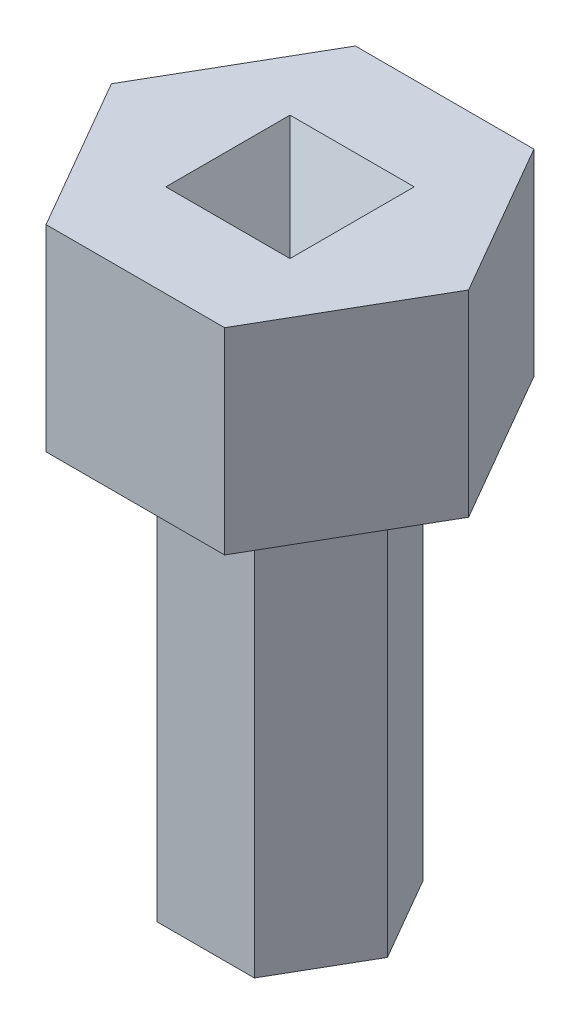
ISO-10303-21;
HEADER;
FILE_DESCRIPTION(('STEP AP214'),'2;1');
FILE_NAME('part.step','',(''),(''),'','','');
FILE_SCHEMA(('AUTOMOTIVE_DESIGN { 1 0 10303 214 1 1 1 1 }'));
ENDSEC;
DATA;
#1=APPLICATION_CONTEXT('core data for automotive mechanical design processes');
#2=APPLICATION_PROTOCOL_DEFINITION('international standard','automotive_design',2000,#1);
#3=PRODUCT_CONTEXT('',#1,'mechanical');
#4=PRODUCT('Part','Part','',(#3));
#5=PRODUCT_RELATED_PRODUCT_CATEGORY('part','',(#4));
#6=PRODUCT_DEFINITION_FORMATION('','',#4);
#7=PRODUCT_DEFINITION_CONTEXT('part definition',#1,'design');
#8=PRODUCT_DEFINITION('design','',#6,#7);
#9=PRODUCT_DEFINITION_SHAPE('','',#8);
#10=(LENGTH_UNIT() NAMED_UNIT(*) SI_UNIT(.MILLI.,.METRE.));
#11=(NAMED_UNIT(*) PLANE_ANGLE_UNIT() SI_UNIT($,.RADIAN.));
#12=(NAMED_UNIT(*) SI_UNIT($,.STERADIAN.) SOLID_ANGLE_UNIT());
#13=UNCERTAINTY_MEASURE_WITH_UNIT(LENGTH_MEASURE(1.E-05),#10,'distance_accuracy_value','');
#14=(GEOMETRIC_REPRESENTATION_CONTEXT(3) GLOBAL_UNCERTAINTY_ASSIGNED_CONTEXT((#13)) GLOBAL_UNIT_ASSIGNED_CONTEXT((#10,
#11,#12)) REPRESENTATION_CONTEXT('',''));
#15=CARTESIAN_POINT('',(0.,0.,0.));
#16=DIRECTION('',(0.,0.,1.));
#17=DIRECTION('',(1.,0.,0.));
#18=AXIS2_PLACEMENT_3D('',#15,#16,#17);
#19=CARTESIAN_POINT('',(-3.46410161513776,30.,6.));
#20=DIRECTION('',(0.,0.,-1.));
#21=DIRECTION('',(-1.,0.,0.));
#22=AXIS2_PLACEMENT_3D('',#19,#20,#21);
#23=PLANE('',#22);
#24=DIRECTION('',(1.,0.,0.));
#25=VECTOR('',#24,1.);
#26=CARTESIAN_POINT('',(-3.46410161513776,0.,6.));
#27=LINE('',#26,#25);
#28=CARTESIAN_POINT('',(-3.46410161513776,0.,6.));
#29=VERTEX_POINT('',#28);
#30=CARTESIAN_POINT('',(3.46410161513776,0.,6.));
#31=VERTEX_POINT('',#30);
#32=EDGE_CURVE('E212',#29,#31,#27,.T.);
#33=ORIENTED_EDGE('',*,*,#32,.T.);
#34=DIRECTION('',(0.,-1.,0.));
#35=VECTOR('',#34,1.);
#36=CARTESIAN_POINT('',(3.46410161513776,30.,6.));
#37=LINE('',#36,#35);
#38=CARTESIAN_POINT('',(3.46410161513776,30.,6.));
#39=VERTEX_POINT('',#38);
#40=EDGE_CURVE('E258',#39,#31,#37,.T.);
#41=ORIENTED_EDGE('',*,*,#40,.F.);
#42=DIRECTION('',(1.,0.,0.));
#43=VECTOR('',#42,1.);
#44=CARTESIAN_POINT('',(-3.46410161513776,30.,6.));
#45=LINE('',#44,#43);
#46=CARTESIAN_POINT('',(-3.46410161513776,30.,6.));
#47=VERTEX_POINT('',#46);
#48=EDGE_CURVE('E213',#47,#39,#45,.T.);
#49=ORIENTED_EDGE('',*,*,#48,.F.);
#50=DIRECTION('',(0.,-1.,0.));
#51=VECTOR('',#50,1.);
#52=CARTESIAN_POINT('',(-3.46410161513776,30.,6.));
#53=LINE('',#52,#51);
#54=EDGE_CURVE('E232',#47,#29,#53,.T.);
#55=ORIENTED_EDGE('',*,*,#54,.T.);
#56=EDGE_LOOP('',(#33,#41,#49,#55));
#57=FACE_BOUND('',#56,.T.);
#58=ADVANCED_FACE('F32',(#57),#23,.F.);
#59=CARTESIAN_POINT('',(3.46410161513776,30.,6.));
#60=DIRECTION('',(-0.866025403784439,0.,-0.5));
#61=DIRECTION('',(-0.5,0.,0.866025403784439));
#62=AXIS2_PLACEMENT_3D('',#59,#60,#61);
#63=PLANE('',#62);
#64=DIRECTION('',(0.5,0.,-0.866025403784438));
#65=VECTOR('',#64,1.);
#66=CARTESIAN_POINT('',(3.46410161513776,0.,6.));
#67=LINE('',#66,#65);
#68=CARTESIAN_POINT('',(6.92820323027551,0.,0.));
#69=VERTEX_POINT('',#68);
#70=EDGE_CURVE('E235',#31,#69,#67,.T.);
#71=ORIENTED_EDGE('',*,*,#70,.T.);
#72=DIRECTION('',(0.,-1.,0.));
#73=VECTOR('',#72,1.);
#74=CARTESIAN_POINT('',(6.92820323027551,30.,0.));
#75=LINE('',#74,#73);
#76=CARTESIAN_POINT('',(6.92820323027551,30.,0.));
#77=VERTEX_POINT('',#76);
#78=EDGE_CURVE('E255',#77,#69,#75,.T.);
#79=ORIENTED_EDGE('',*,*,#78,.F.);
#80=DIRECTION('',(0.5,0.,-0.866025403784438));
#81=VECTOR('',#80,1.);
#82=CARTESIAN_POINT('',(3.46410161513776,30.,6.));
#83=LINE('',#82,#81);
#84=EDGE_CURVE('E216',#39,#77,#83,.T.);
#85=ORIENTED_EDGE('',*,*,#84,.F.);
#86=ORIENTED_EDGE('',*,*,#40,.T.);
#87=EDGE_LOOP('',(#71,#79,#85,#86));
#88=FACE_BOUND('',#87,.T.);
#89=ADVANCED_FACE('F282',(#88),#63,.F.);
#90=CARTESIAN_POINT('',(6.92820323027551,30.,0.));
#91=DIRECTION('',(-0.866025403784439,0.,0.5));
#92=DIRECTION('',(0.5,0.,0.866025403784439));
#93=AXIS2_PLACEMENT_3D('',#90,#91,#92);
#94=PLANE('',#93);
#95=DIRECTION('',(-0.5,0.,-0.866025403784439));
#96=VECTOR('',#95,1.);
#97=CARTESIAN_POINT('',(6.92820323027551,0.,0.));
#98=LINE('',#97,#96);
#99=CARTESIAN_POINT('',(3.46410161513776,0.,-6.));
#100=VERTEX_POINT('',#99);
#101=EDGE_CURVE('E237',#69,#100,#98,.T.);
#102=ORIENTED_EDGE('',*,*,#101,.T.);
#103=DIRECTION('',(0.,-1.,0.));
#104=VECTOR('',#103,1.);
#105=CARTESIAN_POINT('',(3.46410161513776,30.,-6.));
#106=LINE('',#105,#104);
#107=CARTESIAN_POINT('',(3.46410161513776,30.,-6.));
#108=VERTEX_POINT('',#107);
#109=EDGE_CURVE('E252',#108,#100,#106,.T.);
#110=ORIENTED_EDGE('',*,*,#109,.F.);
#111=DIRECTION('',(-0.5,0.,-0.866025403784439));
#112=VECTOR('',#111,1.);
#113=CARTESIAN_POINT('',(6.92820323027551,30.,0.));
#114=LINE('',#113,#112);
#115=EDGE_CURVE('E220',#77,#108,#114,.T.);
#116=ORIENTED_EDGE('',*,*,#115,.F.);
#117=ORIENTED_EDGE('',*,*,#78,.T.);
#118=EDGE_LOOP('',(#102,#110,#116,#117));
#119=FACE_BOUND('',#118,.T.);
#120=ADVANCED_FACE('F288',(#119),#94,.F.);
#121=CARTESIAN_POINT('',(3.46410161513776,30.,-6.));
#122=DIRECTION('',(0.,0.,1.));
#123=DIRECTION('',(1.,0.,0.));
#124=AXIS2_PLACEMENT_3D('',#121,#122,#123);
#125=PLANE('',#124);
#126=DIRECTION('',(-1.,0.,0.));
#127=VECTOR('',#126,1.);
#128=CARTESIAN_POINT('',(3.46410161513776,0.,-6.));
#129=LINE('',#128,#127);
#130=CARTESIAN_POINT('',(-3.46410161513776,0.,-6.));
#131=VERTEX_POINT('',#130);
#132=EDGE_CURVE('E239',#100,#131,#129,.T.);
#133=ORIENTED_EDGE('',*,*,#132,.T.);
#134=DIRECTION('',(0.,-1.,0.));
#135=VECTOR('',#134,1.);
#136=CARTESIAN_POINT('',(-3.46410161513776,30.,-6.));
#137=LINE('',#136,#135);
#138=CARTESIAN_POINT('',(-3.46410161513776,30.,-6.));
#139=VERTEX_POINT('',#138);
#140=EDGE_CURVE('E249',#139,#131,#137,.T.);
#141=ORIENTED_EDGE('',*,*,#140,.F.);
#142=DIRECTION('',(-1.,0.,0.));
#143=VECTOR('',#142,1.);
#144=CARTESIAN_POINT('',(3.46410161513776,30.,-6.));
#145=LINE('',#144,#143);
#146=EDGE_CURVE('E223',#108,#139,#145,.T.);
#147=ORIENTED_EDGE('',*,*,#146,.F.);
#148=ORIENTED_EDGE('',*,*,#109,.T.);
#149=EDGE_LOOP('',(#133,#141,#147,#148));
#150=FACE_BOUND('',#149,.T.);
#151=ADVANCED_FACE('F294',(#150),#125,.F.);
#152=CARTESIAN_POINT('',(-3.46410161513776,30.,-6.));
#153=DIRECTION('',(0.866025403784439,0.,0.5));
#154=DIRECTION('',(0.5,0.,-0.866025403784439));
#155=AXIS2_PLACEMENT_3D('',#152,#153,#154);
#156=PLANE('',#155);
#157=DIRECTION('',(-0.5,0.,0.866025403784439));
#158=VECTOR('',#157,1.);
#159=CARTESIAN_POINT('',(-3.46410161513776,0.,-6.));
#160=LINE('',#159,#158);
#161=CARTESIAN_POINT('',(-6.92820323027551,0.,0.));
#162=VERTEX_POINT('',#161);
#163=EDGE_CURVE('E241',#131,#162,#160,.T.);
#164=ORIENTED_EDGE('',*,*,#163,.T.);
#165=DIRECTION('',(0.,-1.,0.));
#166=VECTOR('',#165,1.);
#167=CARTESIAN_POINT('',(-6.92820323027551,30.,0.));
#168=LINE('',#167,#166);
#169=CARTESIAN_POINT('',(-6.92820323027551,30.,0.));
#170=VERTEX_POINT('',#169);
#171=EDGE_CURVE('E246',#170,#162,#168,.T.);
#172=ORIENTED_EDGE('',*,*,#171,.F.);
#173=DIRECTION('',(-0.5,0.,0.866025403784439));
#174=VECTOR('',#173,1.);
#175=CARTESIAN_POINT('',(-3.46410161513776,30.,-6.));
#176=LINE('',#175,#174);
#177=EDGE_CURVE('E226',#139,#170,#176,.T.);
#178=ORIENTED_EDGE('',*,*,#177,.F.);
#179=ORIENTED_EDGE('',*,*,#140,.T.);
#180=EDGE_LOOP('',(#164,#172,#178,#179));
#181=FACE_BOUND('',#180,.T.);
#182=ADVANCED_FACE('F298',(#181),#156,.F.);
#183=CARTESIAN_POINT('',(-6.92820323027551,30.,0.));
#184=DIRECTION('',(0.866025403784439,0.,-0.5));
#185=DIRECTION('',(-0.5,0.,-0.866025403784439));
#186=AXIS2_PLACEMENT_3D('',#183,#184,#185);
#187=PLANE('',#186);
#188=DIRECTION('',(0.5,0.,0.866025403784439));
#189=VECTOR('',#188,1.);
#190=CARTESIAN_POINT('',(-6.92820323027551,0.,0.));
#191=LINE('',#190,#189);
#192=EDGE_CURVE('E217',#162,#29,#191,.T.);
#193=ORIENTED_EDGE('',*,*,#192,.T.);
#194=ORIENTED_EDGE('',*,*,#54,.F.);
#195=DIRECTION('',(0.5,0.,0.866025403784439));
#196=VECTOR('',#195,1.);
#197=CARTESIAN_POINT('',(-6.92820323027551,30.,0.));
#198=LINE('',#197,#196);
#199=EDGE_CURVE('E229',#170,#47,#198,.T.);
#200=ORIENTED_EDGE('',*,*,#199,.F.);
#201=ORIENTED_EDGE('',*,*,#171,.T.);
#202=EDGE_LOOP('',(#193,#194,#200,#201));
#203=FACE_BOUND('',#202,.T.);
#204=ADVANCED_FACE('F302',(#203),#187,.F.);
#205=CARTESIAN_POINT('',(0.,0.,0.));
#206=DIRECTION('',(0.,1.,0.));
#207=DIRECTION('',(0.,0.,1.));
#208=AXIS2_PLACEMENT_3D('',#205,#206,#207);
#209=PLANE('',#208);
#210=ORIENTED_EDGE('',*,*,#32,.F.);
#211=ORIENTED_EDGE('',*,*,#192,.F.);
#212=ORIENTED_EDGE('',*,*,#163,.F.);
#213=ORIENTED_EDGE('',*,*,#132,.F.);
#214=ORIENTED_EDGE('',*,*,#101,.F.);
#215=ORIENTED_EDGE('',*,*,#70,.F.);
#216=EDGE_LOOP('',(#210,#211,#212,#213,#214,#215));
#217=FACE_BOUND('',#216,.T.);
#218=ADVANCED_FACE('F306',(#217),#209,.F.);
#219=CARTESIAN_POINT('',(0.,30.,0.));
#220=DIRECTION('',(0.,1.,0.));
#221=DIRECTION('',(0.,0.,1.));
#222=AXIS2_PLACEMENT_3D('',#219,#220,#221);
#223=PLANE('',#222);
#224=DIRECTION('',(1.,0.,0.));
#225=VECTOR('',#224,1.);
#226=CARTESIAN_POINT('',(-6.35085296108588,30.,11.));
#227=LINE('',#226,#225);
#228=CARTESIAN_POINT('',(-6.35085296108588,30.,11.));
#229=VERTEX_POINT('',#228);
#230=CARTESIAN_POINT('',(6.35085296108588,30.,11.));
#231=VERTEX_POINT('',#230);
#232=EDGE_CURVE('E168',#229,#231,#227,.T.);
#233=ORIENTED_EDGE('',*,*,#232,.F.);
#234=DIRECTION('',(0.5,0.,0.866025403784438));
#235=VECTOR('',#234,1.);
#236=CARTESIAN_POINT('',(-12.7017059221718,30.,0.));
#237=LINE('',#236,#235);
#238=CARTESIAN_POINT('',(-12.7017059221718,30.,0.));
#239=VERTEX_POINT('',#238);
#240=EDGE_CURVE('E173',#239,#229,#237,.T.);
#241=ORIENTED_EDGE('',*,*,#240,.F.);
#242=DIRECTION('',(-0.5,0.,0.866025403784439));
#243=VECTOR('',#242,1.);
#244=CARTESIAN_POINT('',(-6.35085296108589,30.,-11.));
#245=LINE('',#244,#243);
#246=CARTESIAN_POINT('',(-6.35085296108589,30.,-11.));
#247=VERTEX_POINT('',#246);
#248=EDGE_CURVE('E192',#247,#239,#245,.T.);
#249=ORIENTED_EDGE('',*,*,#248,.F.);
#250=DIRECTION('',(-1.,0.,0.));
#251=VECTOR('',#250,1.);
#252=CARTESIAN_POINT('',(6.35085296108588,30.,-11.));
#253=LINE('',#252,#251);
#254=CARTESIAN_POINT('',(6.35085296108588,30.,-11.));
#255=VERTEX_POINT('',#254);
#256=EDGE_CURVE('E190',#255,#247,#253,.T.);
#257=ORIENTED_EDGE('',*,*,#256,.F.);
#258=DIRECTION('',(-0.5,0.,-0.866025403784438));
#259=VECTOR('',#258,1.);
#260=CARTESIAN_POINT('',(12.7017059221718,30.,0.));
#261=LINE('',#260,#259);
#262=CARTESIAN_POINT('',(12.7017059221718,30.,0.));
#263=VERTEX_POINT('',#262);
#264=EDGE_CURVE('E188',#263,#255,#261,.T.);
#265=ORIENTED_EDGE('',*,*,#264,.F.);
#266=DIRECTION('',(0.5,0.,-0.866025403784439));
#267=VECTOR('',#266,1.);
#268=CARTESIAN_POINT('',(6.35085296108588,30.,11.));
#269=LINE('',#268,#267);
#270=EDGE_CURVE('E186',#231,#263,#269,.T.);
#271=ORIENTED_EDGE('',*,*,#270,.F.);
#272=EDGE_LOOP('',(#233,#241,#249,#257,#265,#271));
#273=FACE_BOUND('',#272,.T.);
#274=ORIENTED_EDGE('',*,*,#199,.T.);
#275=ORIENTED_EDGE('',*,*,#48,.T.);
#276=ORIENTED_EDGE('',*,*,#84,.T.);
#277=ORIENTED_EDGE('',*,*,#115,.T.);
#278=ORIENTED_EDGE('',*,*,#146,.T.);
#279=ORIENTED_EDGE('',*,*,#177,.T.);
#280=EDGE_LOOP('',(#274,#275,#276,#277,#278,#279));
#281=FACE_BOUND('',#280,.T.);
#282=ADVANCED_FACE('F310',(#273,#281),#223,.F.);
#283=CARTESIAN_POINT('',(-6.35085296108588,44.,11.));
#284=DIRECTION('',(0.,0.,-1.));
#285=DIRECTION('',(-1.,0.,0.));
#286=AXIS2_PLACEMENT_3D('',#283,#284,#285);
#287=PLANE('',#286);
#288=ORIENTED_EDGE('',*,*,#232,.T.);
#289=DIRECTION('',(0.,-1.,0.));
#290=VECTOR('',#289,1.);
#291=CARTESIAN_POINT('',(6.35085296108588,44.,11.));
#292=LINE('',#291,#290);
#293=CARTESIAN_POINT('',(6.35085296108588,44.,11.));
#294=VERTEX_POINT('',#293);
#295=EDGE_CURVE('E209',#294,#231,#292,.T.);
#296=ORIENTED_EDGE('',*,*,#295,.F.);
#297=DIRECTION('',(1.,0.,0.));
#298=VECTOR('',#297,1.);
#299=CARTESIAN_POINT('',(-6.35085296108588,44.,11.));
#300=LINE('',#299,#298);
#301=CARTESIAN_POINT('',(-6.35085296108588,44.,11.));
#302=VERTEX_POINT('',#301);
#303=EDGE_CURVE('E169',#302,#294,#300,.T.);
#304=ORIENTED_EDGE('',*,*,#303,.F.);
#305=DIRECTION('',(0.,-1.,0.));
#306=VECTOR('',#305,1.);
#307=CARTESIAN_POINT('',(-6.35085296108588,44.,11.));
#308=LINE('',#307,#306);
#309=EDGE_CURVE('E183',#302,#229,#308,.T.);
#310=ORIENTED_EDGE('',*,*,#309,.T.);
#311=EDGE_LOOP('',(#288,#296,#304,#310));
#312=FACE_BOUND('',#311,.T.);
#313=ADVANCED_FACE('F312',(#312),#287,.F.);
#314=CARTESIAN_POINT('',(6.35085296108588,44.,11.));
#315=DIRECTION('',(-0.866025403784439,0.,-0.5));
#316=DIRECTION('',(-0.5,0.,0.866025403784439));
#317=AXIS2_PLACEMENT_3D('',#314,#315,#316);
#318=PLANE('',#317);
#319=ORIENTED_EDGE('',*,*,#270,.T.);
#320=DIRECTION('',(0.,-1.,0.));
#321=VECTOR('',#320,1.);
#322=CARTESIAN_POINT('',(12.7017059221718,44.,0.));
#323=LINE('',#322,#321);
#324=CARTESIAN_POINT('',(12.7017059221718,44.,0.));
#325=VERTEX_POINT('',#324);
#326=EDGE_CURVE('E206',#325,#263,#323,.T.);
#327=ORIENTED_EDGE('',*,*,#326,.F.);
#328=DIRECTION('',(0.5,0.,-0.866025403784439));
#329=VECTOR('',#328,1.);
#330=CARTESIAN_POINT('',(6.35085296108588,44.,11.));
#331=LINE('',#330,#329);
#332=EDGE_CURVE('E172',#294,#325,#331,.T.);
#333=ORIENTED_EDGE('',*,*,#332,.F.);
#334=ORIENTED_EDGE('',*,*,#295,.T.);
#335=EDGE_LOOP('',(#319,#327,#333,#334));
#336=FACE_BOUND('',#335,.T.);
#337=ADVANCED_FACE('F315',(#336),#318,.F.);
#338=CARTESIAN_POINT('',(12.7017059221718,44.,0.));
#339=DIRECTION('',(-0.866025403784438,0.,0.5));
#340=DIRECTION('',(0.5,0.,0.866025403784439));
#341=AXIS2_PLACEMENT_3D('',#338,#339,#340);
#342=PLANE('',#341);
#343=ORIENTED_EDGE('',*,*,#264,.T.);
#344=DIRECTION('',(0.,-1.,0.));
#345=VECTOR('',#344,1.);
#346=CARTESIAN_POINT('',(6.35085296108588,44.,-11.));
#347=LINE('',#346,#345);
#348=CARTESIAN_POINT('',(6.35085296108588,44.,-11.));
#349=VERTEX_POINT('',#348);
#350=EDGE_CURVE('E203',#349,#255,#347,.T.);
#351=ORIENTED_EDGE('',*,*,#350,.F.);
#352=DIRECTION('',(-0.5,0.,-0.866025403784438));
#353=VECTOR('',#352,1.);
#354=CARTESIAN_POINT('',(12.7017059221718,44.,0.));
#355=LINE('',#354,#353);
#356=EDGE_CURVE('E175',#325,#349,#355,.T.);
#357=ORIENTED_EDGE('',*,*,#356,.F.);
#358=ORIENTED_EDGE('',*,*,#326,.T.);
#359=EDGE_LOOP('',(#343,#351,#357,#358));
#360=FACE_BOUND('',#359,.T.);
#361=ADVANCED_FACE('F319',(#360),#342,.F.);
#362=CARTESIAN_POINT('',(6.35085296108588,44.,-11.));
#363=DIRECTION('',(0.,0.,1.));
#364=DIRECTION('',(1.,0.,0.));
#365=AXIS2_PLACEMENT_3D('',#362,#363,#364);
#366=PLANE('',#365);
#367=ORIENTED_EDGE('',*,*,#256,.T.);
#368=DIRECTION('',(0.,-1.,0.));
#369=VECTOR('',#368,1.);
#370=CARTESIAN_POINT('',(-6.35085296108589,44.,-11.));
#371=LINE('',#370,#369);
#372=CARTESIAN_POINT('',(-6.35085296108589,44.,-11.));
#373=VERTEX_POINT('',#372);
#374=EDGE_CURVE('E200',#373,#247,#371,.T.);
#375=ORIENTED_EDGE('',*,*,#374,.F.);
#376=DIRECTION('',(-1.,0.,0.));
#377=VECTOR('',#376,1.);
#378=CARTESIAN_POINT('',(6.35085296108588,44.,-11.));
#379=LINE('',#378,#377);
#380=EDGE_CURVE('E177',#349,#373,#379,.T.);
#381=ORIENTED_EDGE('',*,*,#380,.F.);
#382=ORIENTED_EDGE('',*,*,#350,.T.);
#383=EDGE_LOOP('',(#367,#375,#381,#382));
#384=FACE_BOUND('',#383,.T.);
#385=ADVANCED_FACE('F323',(#384),#366,.F.);
#386=CARTESIAN_POINT('',(-6.35085296108589,44.,-11.));
#387=DIRECTION('',(0.866025403784439,0.,0.5));
#388=DIRECTION('',(0.5,0.,-0.866025403784439));
#389=AXIS2_PLACEMENT_3D('',#386,#387,#388);
#390=PLANE('',#389);
#391=ORIENTED_EDGE('',*,*,#248,.T.);
#392=DIRECTION('',(0.,-1.,0.));
#393=VECTOR('',#392,1.);
#394=CARTESIAN_POINT('',(-12.7017059221718,44.,0.));
#395=LINE('',#394,#393);
#396=CARTESIAN_POINT('',(-12.7017059221718,44.,0.));
#397=VERTEX_POINT('',#396);
#398=EDGE_CURVE('E197',#397,#239,#395,.T.);
#399=ORIENTED_EDGE('',*,*,#398,.F.);
#400=DIRECTION('',(-0.5,0.,0.866025403784439));
#401=VECTOR('',#400,1.);
#402=CARTESIAN_POINT('',(-6.35085296108589,44.,-11.));
#403=LINE('',#402,#401);
#404=EDGE_CURVE('E179',#373,#397,#403,.T.);
#405=ORIENTED_EDGE('',*,*,#404,.F.);
#406=ORIENTED_EDGE('',*,*,#374,.T.);
#407=EDGE_LOOP('',(#391,#399,#405,#406));
#408=FACE_BOUND('',#407,.T.);
#409=ADVANCED_FACE('F327',(#408),#390,.F.);
#410=CARTESIAN_POINT('',(-12.7017059221718,44.,0.));
#411=DIRECTION('',(0.866025403784438,0.,-0.5));
#412=DIRECTION('',(-0.5,0.,-0.866025403784439));
#413=AXIS2_PLACEMENT_3D('',#410,#411,#412);
#414=PLANE('',#413);
#415=ORIENTED_EDGE('',*,*,#240,.T.);
#416=ORIENTED_EDGE('',*,*,#309,.F.);
#417=DIRECTION('',(0.5,0.,0.866025403784438));
#418=VECTOR('',#417,1.);
#419=CARTESIAN_POINT('',(-12.7017059221718,44.,0.));
#420=LINE('',#419,#418);
#421=EDGE_CURVE('E181',#397,#302,#420,.T.);
#422=ORIENTED_EDGE('',*,*,#421,.F.);
#423=ORIENTED_EDGE('',*,*,#398,.T.);
#424=EDGE_LOOP('',(#415,#416,#422,#423));
#425=FACE_BOUND('',#424,.T.);
#426=ADVANCED_FACE('F331',(#425),#414,.F.);
#427=CARTESIAN_POINT('',(0.,44.,0.));
#428=DIRECTION('',(0.,1.,0.));
#429=DIRECTION('',(0.,0.,1.));
#430=AXIS2_PLACEMENT_3D('',#427,#428,#429);
#431=PLANE('',#430);
#432=DIRECTION('',(0.,0.,1.));
#433=VECTOR('',#432,1.);
#434=CARTESIAN_POINT('',(4.41764281119443,44.,0.0500000000000001));
#435=LINE('',#434,#433);
#436=CARTESIAN_POINT('',(4.41764281119443,44.,-4.41764281119443));
#437=VERTEX_POINT('',#436);
#438=CARTESIAN_POINT('',(4.41764281119443,44.,4.41764281119443));
#439=VERTEX_POINT('',#438);
#440=EDGE_CURVE('E261',#437,#439,#435,.T.);
#441=ORIENTED_EDGE('',*,*,#440,.T.);
#442=DIRECTION('',(-1.,0.,0.));
#443=VECTOR('',#442,1.);
#444=CARTESIAN_POINT('',(-0.0499999999999997,44.,4.41764281119443));
#445=LINE('',#444,#443);
#446=CARTESIAN_POINT('',(-4.41764281119441,44.,4.41764281119443));
#447=VERTEX_POINT('',#446);
#448=EDGE_CURVE('E11',#439,#447,#445,.T.);
#449=ORIENTED_EDGE('',*,*,#448,.T.);
#450=DIRECTION('',(0.,0.,-1.));
#451=VECTOR('',#450,1.);
#452=CARTESIAN_POINT('',(-4.41764281119443,44.,-0.0499999999999812));
#453=LINE('',#452,#451);
#454=CARTESIAN_POINT('',(-4.41764281119445,44.,-4.41764281119443));
#455=VERTEX_POINT('',#454);
#456=EDGE_CURVE('E41',#447,#455,#453,.T.);
#457=ORIENTED_EDGE('',*,*,#456,.T.);
#458=DIRECTION('',(1.,0.,0.));
#459=VECTOR('',#458,1.);
#460=CARTESIAN_POINT('',(0.0500000000000001,44.,-4.41764281119443));
#461=LINE('',#460,#459);
#462=EDGE_CURVE('E263',#455,#437,#461,.T.);
#463=ORIENTED_EDGE('',*,*,#462,.T.);
#464=EDGE_LOOP('',(#441,#449,#457,#463));
#465=FACE_BOUND('',#464,.T.);
#466=ORIENTED_EDGE('',*,*,#303,.T.);
#467=ORIENTED_EDGE('',*,*,#332,.T.);
#468=ORIENTED_EDGE('',*,*,#356,.T.);
#469=ORIENTED_EDGE('',*,*,#380,.T.);
#470=ORIENTED_EDGE('',*,*,#404,.T.);
#471=ORIENTED_EDGE('',*,*,#421,.T.);
#472=EDGE_LOOP('',(#466,#467,#468,#469,#470,#471));
#473=FACE_BOUND('',#472,.T.);
#474=ADVANCED_FACE('F271',(#465,#473),#431,.T.);
#475=CARTESIAN_POINT('',(0.,32.,0.));
#476=DIRECTION('',(0.,1.,0.));
#477=DIRECTION('',(0.,0.,1.));
#478=AXIS2_PLACEMENT_3D('',#475,#476,#477);
#479=PLANE('',#478);
#480=DIRECTION('',(0.,0.,1.));
#481=VECTOR('',#480,1.);
#482=CARTESIAN_POINT('',(-0.0500000000000001,32.,-0.0500000000000001));
#483=LINE('',#482,#481);
#484=CARTESIAN_POINT('',(-0.0500000000000001,32.,-0.0500000000000001));
#485=VERTEX_POINT('',#484);
#486=CARTESIAN_POINT('',(-0.0499999999999997,32.,0.0500000000000001));
#487=VERTEX_POINT('',#486);
#488=EDGE_CURVE('E147',#485,#487,#483,.T.);
#489=ORIENTED_EDGE('',*,*,#488,.T.);
#490=DIRECTION('',(1.,0.,0.));
#491=VECTOR('',#490,1.);
#492=CARTESIAN_POINT('',(-0.0499999999999997,32.,0.0500000000000001));
#493=LINE('',#492,#491);
#494=CARTESIAN_POINT('',(0.0500000000000001,32.,0.0500000000000001));
#495=VERTEX_POINT('',#494);
#496=EDGE_CURVE('E149',#487,#495,#493,.T.);
#497=ORIENTED_EDGE('',*,*,#496,.T.);
#498=DIRECTION('',(0.,0.,-1.));
#499=VECTOR('',#498,1.);
#500=CARTESIAN_POINT('',(0.0500000000000001,32.,-0.0500000000000001));
#501=LINE('',#500,#499);
#502=CARTESIAN_POINT('',(0.0500000000000001,32.,-0.0500000000000001));
#503=VERTEX_POINT('',#502);
#504=EDGE_CURVE('E163',#495,#503,#501,.T.);
#505=ORIENTED_EDGE('',*,*,#504,.T.);
#506=DIRECTION('',(-1.,0.,0.));
#507=VECTOR('',#506,1.);
#508=CARTESIAN_POINT('',(-0.0500000000000001,32.,-0.0500000000000001));
#509=LINE('',#508,#507);
#510=EDGE_CURVE('E151',#503,#485,#509,.T.);
#511=ORIENTED_EDGE('',*,*,#510,.T.);
#512=EDGE_LOOP('',(#489,#497,#505,#511));
#513=FACE_BOUND('',#512,.T.);
#514=ADVANCED_FACE('F148',(#513),#479,.T.);
#515=CARTESIAN_POINT('',(-0.0500000000000001,31.9999999999999,-0.0500000000000001));
#516=DIRECTION('',(0.,0.342020143325666,0.939692620785909));
#517=DIRECTION('',(1.,0.,0.));
#518=AXIS2_PLACEMENT_3D('',#515,#516,#517);
#519=PLANE('',#518);
#520=DIRECTION('',(-0.323615577118183,-0.88912649071599,0.323615577118183));
#521=VECTOR('',#520,1.);
#522=CARTESIAN_POINT('',(0.0395272958246467,31.9712264817575,-0.0395272958246467));
#523=LINE('',#522,#521);
#524=EDGE_CURVE('E157',#437,#503,#523,.T.);
#525=ORIENTED_EDGE('',*,*,#524,.F.);
#526=ORIENTED_EDGE('',*,*,#462,.F.);
#527=DIRECTION('',(0.323615577118184,-0.889126490715989,0.323615577118182));
#528=VECTOR('',#527,1.);
#529=CARTESIAN_POINT('',(-0.0500000000000001,31.9999999999999,-0.0500000000000001));
#530=LINE('',#529,#528);
#531=EDGE_CURVE('E36',#485,#455,#530,.F.);
#532=ORIENTED_EDGE('',*,*,#531,.F.);
#533=ORIENTED_EDGE('',*,*,#510,.F.);
#534=EDGE_LOOP('',(#525,#526,#532,#533));
#535=FACE_BOUND('',#534,.T.);
#536=ADVANCED_FACE('F34',(#535),#519,.T.);
#537=CARTESIAN_POINT('',(-0.0500000000000001,31.9999999999999,-0.0500000000000001));
#538=DIRECTION('',(0.939692620785909,0.342020143325666,0.));
#539=DIRECTION('',(0.,0.,-1.));
#540=AXIS2_PLACEMENT_3D('',#537,#538,#539);
#541=PLANE('',#540);
#542=ORIENTED_EDGE('',*,*,#531,.T.);
#543=ORIENTED_EDGE('',*,*,#456,.F.);
#544=DIRECTION('',(0.323615577118181,-0.88912649071599,-0.323615577118183));
#545=VECTOR('',#544,1.);
#546=CARTESIAN_POINT('',(-0.0499999999999997,31.9999999999999,0.0500000000000001));
#547=LINE('',#546,#545);
#548=EDGE_CURVE('E49',#487,#447,#547,.F.);
#549=ORIENTED_EDGE('',*,*,#548,.F.);
#550=ORIENTED_EDGE('',*,*,#488,.F.);
#551=EDGE_LOOP('',(#542,#543,#549,#550));
#552=FACE_BOUND('',#551,.T.);
#553=ADVANCED_FACE('F156',(#552),#541,.T.);
#554=CARTESIAN_POINT('',(0.0500000000000001,31.9999999999999,-0.0500000000000001));
#555=DIRECTION('',(-0.939692620785909,0.342020143325666,0.));
#556=DIRECTION('',(0.,0.,1.));
#557=AXIS2_PLACEMENT_3D('',#554,#555,#556);
#558=PLANE('',#557);
#559=ORIENTED_EDGE('',*,*,#524,.T.);
#560=ORIENTED_EDGE('',*,*,#504,.F.);
#561=DIRECTION('',(0.323615577118183,0.88912649071599,0.323615577118183));
#562=VECTOR('',#561,1.);
#563=CARTESIAN_POINT('',(0.0395272958246467,31.9712264817575,0.0395272958246467));
#564=LINE('',#563,#562);
#565=EDGE_CURVE('E158',#439,#495,#564,.F.);
#566=ORIENTED_EDGE('',*,*,#565,.F.);
#567=ORIENTED_EDGE('',*,*,#440,.F.);
#568=EDGE_LOOP('',(#559,#560,#566,#567));
#569=FACE_BOUND('',#568,.T.);
#570=ADVANCED_FACE('F273',(#569),#558,.T.);
#571=CARTESIAN_POINT('',(-0.0499999999999997,31.9999999999999,0.0500000000000001));
#572=DIRECTION('',(0.,0.342020143325666,-0.939692620785909));
#573=DIRECTION('',(-1.,0.,0.));
#574=AXIS2_PLACEMENT_3D('',#571,#572,#573);
#575=PLANE('',#574);
#576=ORIENTED_EDGE('',*,*,#548,.T.);
#577=ORIENTED_EDGE('',*,*,#448,.F.);
#578=ORIENTED_EDGE('',*,*,#565,.T.);
#579=ORIENTED_EDGE('',*,*,#496,.F.);
#580=EDGE_LOOP('',(#576,#577,#578,#579));
#581=FACE_BOUND('',#580,.T.);
#582=ADVANCED_FACE('F160',(#581),#575,.T.);
#583=CLOSED_SHELL('',(#58,#89,#120,#151,#182,#204,#218,#282,#313,#337,#361,#385,#409,#426,#474,
#514,#536,#553,#570,#582));
#584=MANIFOLD_SOLID_BREP('B2',#583);
#585=ADVANCED_BREP_SHAPE_REPRESENTATION('',(#18,#584),#14);
#586=SHAPE_DEFINITION_REPRESENTATION(#9,#585);
ENDSEC;
END-ISO-10303-21;
